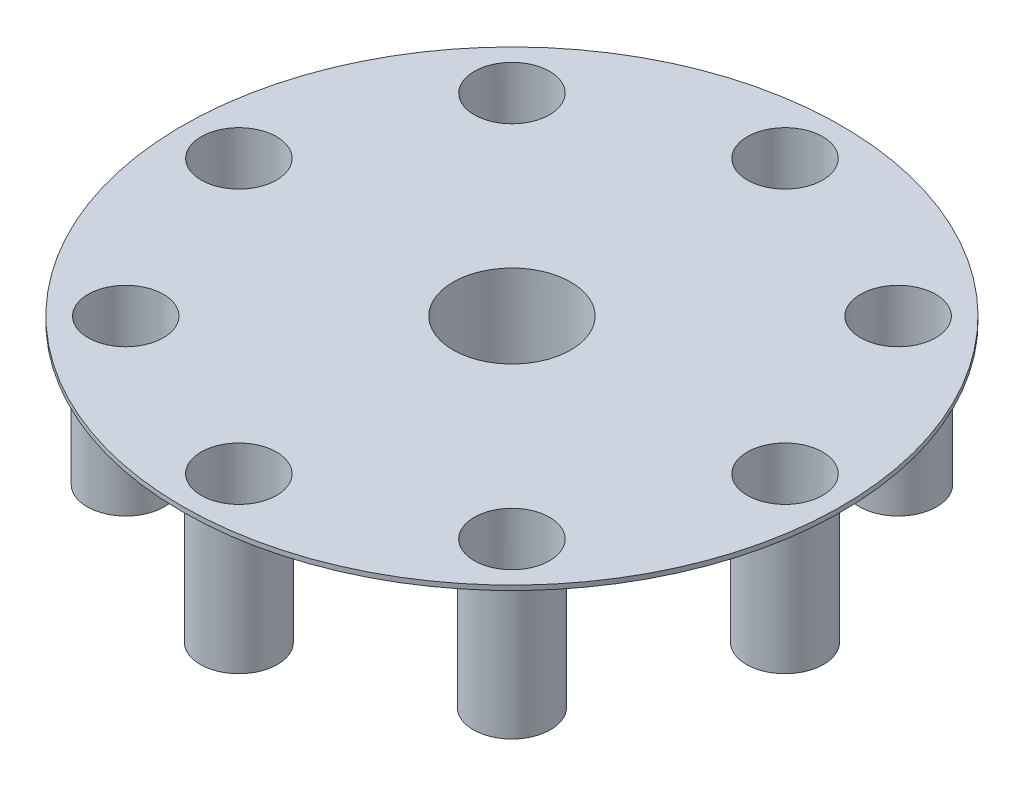
ISO-10303-21;
HEADER;
FILE_DESCRIPTION(('STEP AP214'),'2;1');
FILE_NAME('part.step','',(''),(''),'','','');
FILE_SCHEMA(('AUTOMOTIVE_DESIGN { 1 0 10303 214 1 1 1 1 }'));
ENDSEC;
DATA;
#1=APPLICATION_CONTEXT('core data for automotive mechanical design processes');
#2=APPLICATION_PROTOCOL_DEFINITION('international standard','automotive_design',2000,#1);
#3=PRODUCT_CONTEXT('',#1,'mechanical');
#4=PRODUCT('Part','Part','',(#3));
#5=PRODUCT_RELATED_PRODUCT_CATEGORY('part','',(#4));
#6=PRODUCT_DEFINITION_FORMATION('','',#4);
#7=PRODUCT_DEFINITION_CONTEXT('part definition',#1,'design');
#8=PRODUCT_DEFINITION('design','',#6,#7);
#9=PRODUCT_DEFINITION_SHAPE('','',#8);
#10=(LENGTH_UNIT() NAMED_UNIT(*) SI_UNIT(.MILLI.,.METRE.));
#11=(NAMED_UNIT(*) PLANE_ANGLE_UNIT() SI_UNIT($,.RADIAN.));
#12=(NAMED_UNIT(*) SI_UNIT($,.STERADIAN.) SOLID_ANGLE_UNIT());
#13=UNCERTAINTY_MEASURE_WITH_UNIT(LENGTH_MEASURE(1.E-05),#10,'distance_accuracy_value','');
#14=(GEOMETRIC_REPRESENTATION_CONTEXT(3) GLOBAL_UNCERTAINTY_ASSIGNED_CONTEXT((#13)) GLOBAL_UNIT_ASSIGNED_CONTEXT((#10,
#11,#12)) REPRESENTATION_CONTEXT('',''));
#15=CARTESIAN_POINT('',(0.,0.,0.));
#16=DIRECTION('',(0.,0.,1.));
#17=DIRECTION('',(1.,0.,0.));
#18=AXIS2_PLACEMENT_3D('',#15,#16,#17);
#19=CARTESIAN_POINT('',(0.,5.,0.));
#20=DIRECTION('',(0.,-1.,0.));
#21=DIRECTION('',(0.,0.,-1.));
#22=AXIS2_PLACEMENT_3D('',#19,#20,#21);
#23=CYLINDRICAL_SURFACE('',#22,350.);
#24=CARTESIAN_POINT('',(0.,5.,0.));
#25=DIRECTION('',(0.,1.,0.));
#26=DIRECTION('',(0.,0.,1.));
#27=AXIS2_PLACEMENT_3D('',#24,#25,#26);
#28=CIRCLE('',#27,350.);
#29=CARTESIAN_POINT('',(0.,5.,350.));
#30=VERTEX_POINT('',#29);
#31=EDGE_CURVE('E10',#30,#30,#28,.T.);
#32=ORIENTED_EDGE('',*,*,#31,.F.);
#33=EDGE_LOOP('',(#32));
#34=FACE_BOUND('',#33,.T.);
#35=CARTESIAN_POINT('',(0.,0.,0.));
#36=DIRECTION('',(0.,1.,0.));
#37=DIRECTION('',(0.,0.,1.));
#38=AXIS2_PLACEMENT_3D('',#35,#36,#37);
#39=CIRCLE('',#38,350.);
#40=CARTESIAN_POINT('',(0.,0.,350.));
#41=VERTEX_POINT('',#40);
#42=EDGE_CURVE('E42',#41,#41,#39,.T.);
#43=ORIENTED_EDGE('',*,*,#42,.T.);
#44=EDGE_LOOP('',(#43));
#45=FACE_BOUND('',#44,.T.);
#46=ADVANCED_FACE('F39',(#34,#45),#23,.T.);
#47=CARTESIAN_POINT('',(0.,5.,0.));
#48=DIRECTION('',(0.,1.,0.));
#49=DIRECTION('',(0.,0.,1.));
#50=AXIS2_PLACEMENT_3D('',#47,#48,#49);
#51=PLANE('',#50);
#52=CARTESIAN_POINT('',(-290.,5.,1.00518170746962E-12));
#53=DIRECTION('',(0.,1.,0.));
#54=DIRECTION('',(1.,0.,0.));
#55=AXIS2_PLACEMENT_3D('',#52,#53,#54);
#56=CIRCLE('',#55,40.);
#57=CARTESIAN_POINT('',(-250.,5.,8.65522453915899E-13));
#58=VERTEX_POINT('',#57);
#59=EDGE_CURVE('E76',#58,#58,#56,.T.);
#60=ORIENTED_EDGE('',*,*,#59,.F.);
#61=EDGE_LOOP('',(#60));
#62=FACE_BOUND('',#61,.T.);
#63=CARTESIAN_POINT('',(-205.060966544098,5.,205.0609665441));
#64=DIRECTION('',(0.,1.,0.));
#65=DIRECTION('',(0.707106781186544,0.,-0.707106781186551));
#66=AXIS2_PLACEMENT_3D('',#63,#64,#65);
#67=CIRCLE('',#66,40.);
#68=CARTESIAN_POINT('',(-176.776695296636,5.,176.776695296638));
#69=VERTEX_POINT('',#68);
#70=EDGE_CURVE('E86',#69,#69,#67,.T.);
#71=ORIENTED_EDGE('',*,*,#70,.F.);
#72=EDGE_LOOP('',(#71));
#73=FACE_BOUND('',#72,.T.);
#74=CARTESIAN_POINT('',(0.,5.,290.));
#75=DIRECTION('',(0.,1.,0.));
#76=DIRECTION('',(0.,0.,-1.));
#77=AXIS2_PLACEMENT_3D('',#74,#75,#76);
#78=CIRCLE('',#77,40.);
#79=CARTESIAN_POINT('',(0.,5.,250.));
#80=VERTEX_POINT('',#79);
#81=EDGE_CURVE('E81',#80,#80,#78,.T.);
#82=ORIENTED_EDGE('',*,*,#81,.F.);
#83=EDGE_LOOP('',(#82));
#84=FACE_BOUND('',#83,.T.);
#85=CARTESIAN_POINT('',(205.060966544101,5.,205.060966544097));
#86=DIRECTION('',(0.,1.,0.));
#87=DIRECTION('',(-0.707106781186554,0.,-0.707106781186541));
#88=AXIS2_PLACEMENT_3D('',#85,#86,#87);
#89=CIRCLE('',#88,40.);
#90=CARTESIAN_POINT('',(176.776695296638,5.,176.776695296635));
#91=VERTEX_POINT('',#90);
#92=EDGE_CURVE('E77',#91,#91,#89,.T.);
#93=ORIENTED_EDGE('',*,*,#92,.F.);
#94=EDGE_LOOP('',(#93));
#95=FACE_BOUND('',#94,.T.);
#96=CARTESIAN_POINT('',(290.,5.,-3.03024088399864E-12));
#97=DIRECTION('',(0.,1.,0.));
#98=DIRECTION('',(-1.,0.,0.));
#99=AXIS2_PLACEMENT_3D('',#96,#97,#98);
#100=CIRCLE('',#99,40.);
#101=CARTESIAN_POINT('',(250.,5.,-2.61126312333747E-12));
#102=VERTEX_POINT('',#101);
#103=EDGE_CURVE('E82',#102,#102,#100,.T.);
#104=ORIENTED_EDGE('',*,*,#103,.F.);
#105=EDGE_LOOP('',(#104));
#106=FACE_BOUND('',#105,.T.);
#107=CARTESIAN_POINT('',(205.060966544096,5.,-205.060966544101));
#108=DIRECTION('',(0.,1.,0.));
#109=DIRECTION('',(-0.707106781186539,0.,0.707106781186556));
#110=AXIS2_PLACEMENT_3D('',#107,#108,#109);
#111=CIRCLE('',#110,40.);
#112=CARTESIAN_POINT('',(176.776695296635,5.,-176.776695296639));
#113=VERTEX_POINT('',#112);
#114=EDGE_CURVE('E93',#113,#113,#111,.T.);
#115=ORIENTED_EDGE('',*,*,#114,.F.);
#116=EDGE_LOOP('',(#115));
#117=FACE_BOUND('',#116,.T.);
#118=CARTESIAN_POINT('',(-205.060966544099,5.,-205.060966544098));
#119=DIRECTION('',(0.,1.,0.));
#120=DIRECTION('',(0.707106781186549,0.,0.707106781186546));
#121=AXIS2_PLACEMENT_3D('',#118,#119,#120);
#122=CIRCLE('',#121,40.);
#123=CARTESIAN_POINT('',(-176.776695296637,5.,-176.776695296637));
#124=VERTEX_POINT('',#123);
#125=EDGE_CURVE('E66',#124,#124,#122,.T.);
#126=ORIENTED_EDGE('',*,*,#125,.F.);
#127=EDGE_LOOP('',(#126));
#128=FACE_BOUND('',#127,.T.);
#129=CARTESIAN_POINT('',(0.,5.,-290.));
#130=DIRECTION('',(0.,1.,0.));
#131=DIRECTION('',(0.,0.,1.));
#132=AXIS2_PLACEMENT_3D('',#129,#130,#131);
#133=CIRCLE('',#132,40.);
#134=CARTESIAN_POINT('',(0.,5.,-250.));
#135=VERTEX_POINT('',#134);
#136=EDGE_CURVE('E56',#135,#135,#133,.T.);
#137=ORIENTED_EDGE('',*,*,#136,.F.);
#138=EDGE_LOOP('',(#137));
#139=FACE_BOUND('',#138,.T.);
#140=CARTESIAN_POINT('',(0.,5.,0.));
#141=DIRECTION('',(0.,1.,0.));
#142=DIRECTION('',(0.,0.,1.));
#143=AXIS2_PLACEMENT_3D('',#140,#141,#142);
#144=CIRCLE('',#143,62.5);
#145=CARTESIAN_POINT('',(0.,5.,62.5));
#146=VERTEX_POINT('',#145);
#147=EDGE_CURVE('E51',#146,#146,#144,.T.);
#148=ORIENTED_EDGE('',*,*,#147,.F.);
#149=EDGE_LOOP('',(#148));
#150=FACE_BOUND('',#149,.T.);
#151=ORIENTED_EDGE('',*,*,#31,.T.);
#152=EDGE_LOOP('',(#151));
#153=FACE_BOUND('',#152,.T.);
#154=ADVANCED_FACE('F204',(#62,#73,#84,#95,#106,#117,#128,#139,#150,#153),#51,.T.);
#155=CARTESIAN_POINT('',(0.,0.,0.));
#156=DIRECTION('',(0.,1.,0.));
#157=DIRECTION('',(0.,0.,1.));
#158=AXIS2_PLACEMENT_3D('',#155,#156,#157);
#159=PLANE('',#158);
#160=CARTESIAN_POINT('',(205.060966544096,0.,-205.060966544101));
#161=DIRECTION('',(0.,-1.,0.));
#162=DIRECTION('',(0.707106781186539,0.,-0.707106781186556));
#163=AXIS2_PLACEMENT_3D('',#160,#161,#162);
#164=CIRCLE('',#163,41.);
#165=CARTESIAN_POINT('',(234.052344572744,0.,-234.05234457275));
#166=VERTEX_POINT('',#165);
#167=EDGE_CURVE('E189',#166,#166,#164,.T.);
#168=ORIENTED_EDGE('',*,*,#167,.F.);
#169=EDGE_LOOP('',(#168));
#170=FACE_BOUND('',#169,.T.);
#171=CARTESIAN_POINT('',(290.,0.,-3.03024088399864E-12));
#172=DIRECTION('',(0.,-1.,0.));
#173=DIRECTION('',(1.,0.,0.));
#174=AXIS2_PLACEMENT_3D('',#171,#172,#173);
#175=CIRCLE('',#174,41.);
#176=CARTESIAN_POINT('',(331.,0.,-3.45969308867635E-12));
#177=VERTEX_POINT('',#176);
#178=EDGE_CURVE('E177',#177,#177,#175,.T.);
#179=ORIENTED_EDGE('',*,*,#178,.F.);
#180=EDGE_LOOP('',(#179));
#181=FACE_BOUND('',#180,.T.);
#182=CARTESIAN_POINT('',(205.060966544101,0.,205.060966544097));
#183=DIRECTION('',(0.,-1.,0.));
#184=DIRECTION('',(0.707106781186554,0.,0.707106781186541));
#185=AXIS2_PLACEMENT_3D('',#182,#183,#184);
#186=CIRCLE('',#185,41.);
#187=CARTESIAN_POINT('',(234.052344572749,0.,234.052344572745));
#188=VERTEX_POINT('',#187);
#189=EDGE_CURVE('E165',#188,#188,#186,.T.);
#190=ORIENTED_EDGE('',*,*,#189,.F.);
#191=EDGE_LOOP('',(#190));
#192=FACE_BOUND('',#191,.T.);
#193=CARTESIAN_POINT('',(0.,0.,290.));
#194=DIRECTION('',(0.,-1.,0.));
#195=DIRECTION('',(0.,0.,1.));
#196=AXIS2_PLACEMENT_3D('',#193,#194,#195);
#197=CIRCLE('',#196,41.);
#198=CARTESIAN_POINT('',(0.,0.,331.));
#199=VERTEX_POINT('',#198);
#200=EDGE_CURVE('E153',#199,#199,#197,.T.);
#201=ORIENTED_EDGE('',*,*,#200,.F.);
#202=EDGE_LOOP('',(#201));
#203=FACE_BOUND('',#202,.T.);
#204=CARTESIAN_POINT('',(-205.060966544098,0.,205.0609665441));
#205=DIRECTION('',(0.,-1.,0.));
#206=DIRECTION('',(-0.707106781186544,0.,0.707106781186551));
#207=AXIS2_PLACEMENT_3D('',#204,#205,#206);
#208=CIRCLE('',#207,41.);
#209=CARTESIAN_POINT('',(-234.052344572746,0.,234.052344572748));
#210=VERTEX_POINT('',#209);
#211=EDGE_CURVE('E141',#210,#210,#208,.T.);
#212=ORIENTED_EDGE('',*,*,#211,.F.);
#213=EDGE_LOOP('',(#212));
#214=FACE_BOUND('',#213,.T.);
#215=CARTESIAN_POINT('',(-290.,0.,1.00518170746962E-12));
#216=DIRECTION('',(0.,-1.,0.));
#217=DIRECTION('',(-1.,0.,0.));
#218=AXIS2_PLACEMENT_3D('',#215,#216,#217);
#219=CIRCLE('',#218,41.);
#220=CARTESIAN_POINT('',(-331.,0.,1.14833244236219E-12));
#221=VERTEX_POINT('',#220);
#222=EDGE_CURVE('E129',#221,#221,#219,.T.);
#223=ORIENTED_EDGE('',*,*,#222,.F.);
#224=EDGE_LOOP('',(#223));
#225=FACE_BOUND('',#224,.T.);
#226=CARTESIAN_POINT('',(-205.060966544099,0.,-205.060966544098));
#227=DIRECTION('',(0.,-1.,0.));
#228=DIRECTION('',(-0.707106781186549,0.,-0.707106781186546));
#229=AXIS2_PLACEMENT_3D('',#226,#227,#228);
#230=CIRCLE('',#229,41.);
#231=CARTESIAN_POINT('',(-234.052344572748,0.,-234.052344572747));
#232=VERTEX_POINT('',#231);
#233=EDGE_CURVE('E117',#232,#232,#230,.T.);
#234=ORIENTED_EDGE('',*,*,#233,.F.);
#235=EDGE_LOOP('',(#234));
#236=FACE_BOUND('',#235,.T.);
#237=CARTESIAN_POINT('',(0.,0.,0.));
#238=DIRECTION('',(0.,-1.,0.));
#239=DIRECTION('',(0.,0.,-1.));
#240=AXIS2_PLACEMENT_3D('',#237,#238,#239);
#241=CIRCLE('',#240,63.5);
#242=CARTESIAN_POINT('',(0.,0.,-63.5));
#243=VERTEX_POINT('',#242);
#244=EDGE_CURVE('E105',#243,#243,#241,.T.);
#245=ORIENTED_EDGE('',*,*,#244,.F.);
#246=EDGE_LOOP('',(#245));
#247=FACE_BOUND('',#246,.T.);
#248=CARTESIAN_POINT('',(0.,0.,-290.));
#249=DIRECTION('',(0.,-1.,0.));
#250=DIRECTION('',(0.,0.,-1.));
#251=AXIS2_PLACEMENT_3D('',#248,#249,#250);
#252=CIRCLE('',#251,41.);
#253=CARTESIAN_POINT('',(0.,0.,-331.));
#254=VERTEX_POINT('',#253);
#255=EDGE_CURVE('E65',#254,#254,#252,.T.);
#256=ORIENTED_EDGE('',*,*,#255,.F.);
#257=EDGE_LOOP('',(#256));
#258=FACE_BOUND('',#257,.T.);
#259=ORIENTED_EDGE('',*,*,#42,.F.);
#260=EDGE_LOOP('',(#259));
#261=FACE_BOUND('',#260,.T.);
#262=ADVANCED_FACE('F200',(#170,#181,#192,#203,#214,#225,#236,#247,#258,#261),#159,.F.);
#263=CARTESIAN_POINT('',(0.,0.,0.));
#264=DIRECTION('',(0.,1.,0.));
#265=DIRECTION('',(0.,0.,1.));
#266=AXIS2_PLACEMENT_3D('',#263,#264,#265);
#267=CYLINDRICAL_SURFACE('',#266,62.5);
#268=ORIENTED_EDGE('',*,*,#147,.T.);
#269=EDGE_LOOP('',(#268));
#270=FACE_BOUND('',#269,.T.);
#271=CARTESIAN_POINT('',(0.,-100.,0.));
#272=DIRECTION('',(0.,-1.,0.));
#273=DIRECTION('',(0.,0.,-1.));
#274=AXIS2_PLACEMENT_3D('',#271,#272,#273);
#275=CIRCLE('',#274,62.5);
#276=CARTESIAN_POINT('',(0.,-100.,-62.5));
#277=VERTEX_POINT('',#276);
#278=EDGE_CURVE('E101',#277,#277,#275,.T.);
#279=ORIENTED_EDGE('',*,*,#278,.T.);
#280=EDGE_LOOP('',(#279));
#281=FACE_BOUND('',#280,.T.);
#282=ADVANCED_FACE('F203',(#270,#281),#267,.F.);
#283=CARTESIAN_POINT('',(0.,0.,-290.));
#284=DIRECTION('',(0.,1.,0.));
#285=DIRECTION('',(0.,0.,1.));
#286=AXIS2_PLACEMENT_3D('',#283,#284,#285);
#287=CYLINDRICAL_SURFACE('',#286,40.);
#288=ORIENTED_EDGE('',*,*,#136,.T.);
#289=EDGE_LOOP('',(#288));
#290=FACE_BOUND('',#289,.T.);
#291=CARTESIAN_POINT('',(0.,-150.,-290.));
#292=DIRECTION('',(0.,-1.,0.));
#293=DIRECTION('',(0.,0.,-1.));
#294=AXIS2_PLACEMENT_3D('',#291,#292,#293);
#295=CIRCLE('',#294,40.);
#296=CARTESIAN_POINT('',(0.,-150.,-330.));
#297=VERTEX_POINT('',#296);
#298=EDGE_CURVE('E61',#297,#297,#295,.T.);
#299=ORIENTED_EDGE('',*,*,#298,.T.);
#300=EDGE_LOOP('',(#299));
#301=FACE_BOUND('',#300,.T.);
#302=ADVANCED_FACE('F237',(#290,#301),#287,.F.);
#303=CARTESIAN_POINT('',(0.,-150.,-290.));
#304=DIRECTION('',(0.,1.,0.));
#305=DIRECTION('',(0.,0.,1.));
#306=AXIS2_PLACEMENT_3D('',#303,#304,#305);
#307=PLANE('',#306);
#308=CARTESIAN_POINT('',(0.,-150.,-290.));
#309=DIRECTION('',(0.,-1.,0.));
#310=DIRECTION('',(0.,0.,-1.));
#311=AXIS2_PLACEMENT_3D('',#308,#309,#310);
#312=CIRCLE('',#311,41.);
#313=CARTESIAN_POINT('',(0.,-150.,-331.));
#314=VERTEX_POINT('',#313);
#315=EDGE_CURVE('E60',#314,#314,#312,.T.);
#316=ORIENTED_EDGE('',*,*,#315,.T.);
#317=EDGE_LOOP('',(#316));
#318=FACE_BOUND('',#317,.T.);
#319=ORIENTED_EDGE('',*,*,#298,.F.);
#320=EDGE_LOOP('',(#319));
#321=FACE_BOUND('',#320,.T.);
#322=ADVANCED_FACE('F241',(#318,#321),#307,.F.);
#323=CARTESIAN_POINT('',(0.,0.,-290.));
#324=DIRECTION('',(0.,-1.,0.));
#325=DIRECTION('',(0.,0.,-1.));
#326=AXIS2_PLACEMENT_3D('',#323,#324,#325);
#327=CYLINDRICAL_SURFACE('',#326,41.);
#328=ORIENTED_EDGE('',*,*,#255,.T.);
#329=EDGE_LOOP('',(#328));
#330=FACE_BOUND('',#329,.T.);
#331=ORIENTED_EDGE('',*,*,#315,.F.);
#332=EDGE_LOOP('',(#331));
#333=FACE_BOUND('',#332,.T.);
#334=ADVANCED_FACE('F245',(#330,#333),#327,.T.);
#335=CARTESIAN_POINT('',(-205.060966544099,0.,-205.060966544098));
#336=DIRECTION('',(0.,1.,0.));
#337=DIRECTION('',(0.,0.,1.));
#338=AXIS2_PLACEMENT_3D('',#335,#336,#337);
#339=CYLINDRICAL_SURFACE('',#338,40.);
#340=ORIENTED_EDGE('',*,*,#125,.T.);
#341=EDGE_LOOP('',(#340));
#342=FACE_BOUND('',#341,.T.);
#343=CARTESIAN_POINT('',(-205.060966544099,-150.,-205.060966544098));
#344=DIRECTION('',(0.,-1.,0.));
#345=DIRECTION('',(-0.707106781186549,0.,-0.707106781186546));
#346=AXIS2_PLACEMENT_3D('',#343,#344,#345);
#347=CIRCLE('',#346,40.);
#348=CARTESIAN_POINT('',(-233.345237791561,-150.,-233.34523779156));
#349=VERTEX_POINT('',#348);
#350=EDGE_CURVE('E113',#349,#349,#347,.T.);
#351=ORIENTED_EDGE('',*,*,#350,.T.);
#352=EDGE_LOOP('',(#351));
#353=FACE_BOUND('',#352,.T.);
#354=ADVANCED_FACE('F249',(#342,#353),#339,.F.);
#355=CARTESIAN_POINT('',(205.060966544096,0.,-205.060966544101));
#356=DIRECTION('',(0.,1.,0.));
#357=DIRECTION('',(0.,0.,1.));
#358=AXIS2_PLACEMENT_3D('',#355,#356,#357);
#359=CYLINDRICAL_SURFACE('',#358,40.);
#360=ORIENTED_EDGE('',*,*,#114,.T.);
#361=EDGE_LOOP('',(#360));
#362=FACE_BOUND('',#361,.T.);
#363=CARTESIAN_POINT('',(205.060966544096,-150.,-205.060966544101));
#364=DIRECTION('',(0.,-1.,0.));
#365=DIRECTION('',(0.707106781186539,0.,-0.707106781186556));
#366=AXIS2_PLACEMENT_3D('',#363,#364,#365);
#367=CIRCLE('',#366,40.);
#368=CARTESIAN_POINT('',(233.345237791558,-150.,-233.345237791564));
#369=VERTEX_POINT('',#368);
#370=EDGE_CURVE('E185',#369,#369,#367,.T.);
#371=ORIENTED_EDGE('',*,*,#370,.T.);
#372=EDGE_LOOP('',(#371));
#373=FACE_BOUND('',#372,.T.);
#374=ADVANCED_FACE('F253',(#362,#373),#359,.F.);
#375=CARTESIAN_POINT('',(290.,0.,-3.03024088399864E-12));
#376=DIRECTION('',(0.,1.,0.));
#377=DIRECTION('',(0.,0.,1.));
#378=AXIS2_PLACEMENT_3D('',#375,#376,#377);
#379=CYLINDRICAL_SURFACE('',#378,40.);
#380=ORIENTED_EDGE('',*,*,#103,.T.);
#381=EDGE_LOOP('',(#380));
#382=FACE_BOUND('',#381,.T.);
#383=CARTESIAN_POINT('',(290.,-150.,-3.03024088399864E-12));
#384=DIRECTION('',(0.,-1.,0.));
#385=DIRECTION('',(1.,0.,0.));
#386=AXIS2_PLACEMENT_3D('',#383,#384,#385);
#387=CIRCLE('',#386,40.);
#388=CARTESIAN_POINT('',(330.,-150.,-3.44921864465982E-12));
#389=VERTEX_POINT('',#388);
#390=EDGE_CURVE('E173',#389,#389,#387,.T.);
#391=ORIENTED_EDGE('',*,*,#390,.T.);
#392=EDGE_LOOP('',(#391));
#393=FACE_BOUND('',#392,.T.);
#394=ADVANCED_FACE('F259',(#382,#393),#379,.F.);
#395=CARTESIAN_POINT('',(205.060966544101,0.,205.060966544097));
#396=DIRECTION('',(0.,1.,0.));
#397=DIRECTION('',(0.,0.,1.));
#398=AXIS2_PLACEMENT_3D('',#395,#396,#397);
#399=CYLINDRICAL_SURFACE('',#398,40.);
#400=ORIENTED_EDGE('',*,*,#92,.T.);
#401=EDGE_LOOP('',(#400));
#402=FACE_BOUND('',#401,.T.);
#403=CARTESIAN_POINT('',(205.060966544101,-150.,205.060966544097));
#404=DIRECTION('',(0.,-1.,0.));
#405=DIRECTION('',(0.707106781186554,0.,0.707106781186541));
#406=AXIS2_PLACEMENT_3D('',#403,#404,#405);
#407=CIRCLE('',#406,40.);
#408=CARTESIAN_POINT('',(233.345237791563,-150.,233.345237791559));
#409=VERTEX_POINT('',#408);
#410=EDGE_CURVE('E161',#409,#409,#407,.T.);
#411=ORIENTED_EDGE('',*,*,#410,.T.);
#412=EDGE_LOOP('',(#411));
#413=FACE_BOUND('',#412,.T.);
#414=ADVANCED_FACE('F255',(#402,#413),#399,.F.);
#415=CARTESIAN_POINT('',(0.,0.,290.));
#416=DIRECTION('',(0.,1.,0.));
#417=DIRECTION('',(0.,0.,1.));
#418=AXIS2_PLACEMENT_3D('',#415,#416,#417);
#419=CYLINDRICAL_SURFACE('',#418,40.);
#420=ORIENTED_EDGE('',*,*,#81,.T.);
#421=EDGE_LOOP('',(#420));
#422=FACE_BOUND('',#421,.T.);
#423=CARTESIAN_POINT('',(0.,-150.,290.));
#424=DIRECTION('',(0.,-1.,0.));
#425=DIRECTION('',(0.,0.,1.));
#426=AXIS2_PLACEMENT_3D('',#423,#424,#425);
#427=CIRCLE('',#426,40.);
#428=CARTESIAN_POINT('',(0.,-150.,330.));
#429=VERTEX_POINT('',#428);
#430=EDGE_CURVE('E149',#429,#429,#427,.T.);
#431=ORIENTED_EDGE('',*,*,#430,.T.);
#432=EDGE_LOOP('',(#431));
#433=FACE_BOUND('',#432,.T.);
#434=ADVANCED_FACE('F258',(#422,#433),#419,.F.);
#435=CARTESIAN_POINT('',(-205.060966544098,0.,205.0609665441));
#436=DIRECTION('',(0.,1.,0.));
#437=DIRECTION('',(0.,0.,1.));
#438=AXIS2_PLACEMENT_3D('',#435,#436,#437);
#439=CYLINDRICAL_SURFACE('',#438,40.);
#440=ORIENTED_EDGE('',*,*,#70,.T.);
#441=EDGE_LOOP('',(#440));
#442=FACE_BOUND('',#441,.T.);
#443=CARTESIAN_POINT('',(-205.060966544098,-150.,205.0609665441));
#444=DIRECTION('',(0.,-1.,0.));
#445=DIRECTION('',(-0.707106781186544,0.,0.707106781186551));
#446=AXIS2_PLACEMENT_3D('',#443,#444,#445);
#447=CIRCLE('',#446,40.);
#448=CARTESIAN_POINT('',(-233.345237791559,-150.,233.345237791562));
#449=VERTEX_POINT('',#448);
#450=EDGE_CURVE('E137',#449,#449,#447,.T.);
#451=ORIENTED_EDGE('',*,*,#450,.T.);
#452=EDGE_LOOP('',(#451));
#453=FACE_BOUND('',#452,.T.);
#454=ADVANCED_FACE('F263',(#442,#453),#439,.F.);
#455=CARTESIAN_POINT('',(-290.,0.,1.00518170746962E-12));
#456=DIRECTION('',(0.,1.,0.));
#457=DIRECTION('',(0.,0.,1.));
#458=AXIS2_PLACEMENT_3D('',#455,#456,#457);
#459=CYLINDRICAL_SURFACE('',#458,40.);
#460=ORIENTED_EDGE('',*,*,#59,.T.);
#461=EDGE_LOOP('',(#460));
#462=FACE_BOUND('',#461,.T.);
#463=CARTESIAN_POINT('',(-290.,-150.,1.00518170746962E-12));
#464=DIRECTION('',(0.,-1.,0.));
#465=DIRECTION('',(-1.,0.,0.));
#466=AXIS2_PLACEMENT_3D('',#463,#464,#465);
#467=CIRCLE('',#466,40.);
#468=CARTESIAN_POINT('',(-330.,-150.,1.14484096102335E-12));
#469=VERTEX_POINT('',#468);
#470=EDGE_CURVE('E125',#469,#469,#467,.T.);
#471=ORIENTED_EDGE('',*,*,#470,.T.);
#472=EDGE_LOOP('',(#471));
#473=FACE_BOUND('',#472,.T.);
#474=ADVANCED_FACE('F267',(#462,#473),#459,.F.);
#475=CARTESIAN_POINT('',(0.,-100.,0.));
#476=DIRECTION('',(0.,1.,0.));
#477=DIRECTION('',(0.,0.,1.));
#478=AXIS2_PLACEMENT_3D('',#475,#476,#477);
#479=PLANE('',#478);
#480=CARTESIAN_POINT('',(0.,-100.,0.));
#481=DIRECTION('',(0.,-1.,0.));
#482=DIRECTION('',(0.,0.,-1.));
#483=AXIS2_PLACEMENT_3D('',#480,#481,#482);
#484=CIRCLE('',#483,63.5);
#485=CARTESIAN_POINT('',(0.,-100.,-63.5));
#486=VERTEX_POINT('',#485);
#487=EDGE_CURVE('E97',#486,#486,#484,.T.);
#488=ORIENTED_EDGE('',*,*,#487,.T.);
#489=EDGE_LOOP('',(#488));
#490=FACE_BOUND('',#489,.T.);
#491=ORIENTED_EDGE('',*,*,#278,.F.);
#492=EDGE_LOOP('',(#491));
#493=FACE_BOUND('',#492,.T.);
#494=ADVANCED_FACE('F271',(#490,#493),#479,.F.);
#495=CARTESIAN_POINT('',(0.,0.,0.));
#496=DIRECTION('',(0.,-1.,0.));
#497=DIRECTION('',(0.,0.,-1.));
#498=AXIS2_PLACEMENT_3D('',#495,#496,#497);
#499=CYLINDRICAL_SURFACE('',#498,63.5);
#500=ORIENTED_EDGE('',*,*,#244,.T.);
#501=EDGE_LOOP('',(#500));
#502=FACE_BOUND('',#501,.T.);
#503=ORIENTED_EDGE('',*,*,#487,.F.);
#504=EDGE_LOOP('',(#503));
#505=FACE_BOUND('',#504,.T.);
#506=ADVANCED_FACE('F281',(#502,#505),#499,.T.);
#507=CARTESIAN_POINT('',(-205.060966544099,-150.,-205.060966544098));
#508=DIRECTION('',(0.,1.,0.));
#509=DIRECTION('',(0.707106781186549,0.,0.707106781186546));
#510=AXIS2_PLACEMENT_3D('',#507,#508,#509);
#511=PLANE('',#510);
#512=CARTESIAN_POINT('',(-205.060966544099,-150.,-205.060966544098));
#513=DIRECTION('',(0.,-1.,0.));
#514=DIRECTION('',(-0.707106781186549,0.,-0.707106781186546));
#515=AXIS2_PLACEMENT_3D('',#512,#513,#514);
#516=CIRCLE('',#515,41.);
#517=CARTESIAN_POINT('',(-234.052344572748,-150.,-234.052344572747));
#518=VERTEX_POINT('',#517);
#519=EDGE_CURVE('E106',#518,#518,#516,.T.);
#520=ORIENTED_EDGE('',*,*,#519,.T.);
#521=EDGE_LOOP('',(#520));
#522=FACE_BOUND('',#521,.T.);
#523=ORIENTED_EDGE('',*,*,#350,.F.);
#524=EDGE_LOOP('',(#523));
#525=FACE_BOUND('',#524,.T.);
#526=ADVANCED_FACE('F285',(#522,#525),#511,.F.);
#527=CARTESIAN_POINT('',(-205.060966544099,0.,-205.060966544098));
#528=DIRECTION('',(0.,-1.,0.));
#529=DIRECTION('',(-0.707106781186549,0.,-0.707106781186546));
#530=AXIS2_PLACEMENT_3D('',#527,#528,#529);
#531=CYLINDRICAL_SURFACE('',#530,41.);
#532=ORIENTED_EDGE('',*,*,#233,.T.);
#533=EDGE_LOOP('',(#532));
#534=FACE_BOUND('',#533,.T.);
#535=ORIENTED_EDGE('',*,*,#519,.F.);
#536=EDGE_LOOP('',(#535));
#537=FACE_BOUND('',#536,.T.);
#538=ADVANCED_FACE('F289',(#534,#537),#531,.T.);
#539=CARTESIAN_POINT('',(-290.,-150.,1.00518170746962E-12));
#540=DIRECTION('',(0.,1.,0.));
#541=DIRECTION('',(1.,0.,0.));
#542=AXIS2_PLACEMENT_3D('',#539,#540,#541);
#543=PLANE('',#542);
#544=CARTESIAN_POINT('',(-290.,-150.,1.00518170746962E-12));
#545=DIRECTION('',(0.,-1.,0.));
#546=DIRECTION('',(-1.,0.,0.));
#547=AXIS2_PLACEMENT_3D('',#544,#545,#546);
#548=CIRCLE('',#547,41.);
#549=CARTESIAN_POINT('',(-331.,-150.,1.14833244236219E-12));
#550=VERTEX_POINT('',#549);
#551=EDGE_CURVE('E118',#550,#550,#548,.T.);
#552=ORIENTED_EDGE('',*,*,#551,.T.);
#553=EDGE_LOOP('',(#552));
#554=FACE_BOUND('',#553,.T.);
#555=ORIENTED_EDGE('',*,*,#470,.F.);
#556=EDGE_LOOP('',(#555));
#557=FACE_BOUND('',#556,.T.);
#558=ADVANCED_FACE('F293',(#554,#557),#543,.F.);
#559=CARTESIAN_POINT('',(-290.,0.,1.00518170746962E-12));
#560=DIRECTION('',(0.,-1.,0.));
#561=DIRECTION('',(-1.,0.,0.));
#562=AXIS2_PLACEMENT_3D('',#559,#560,#561);
#563=CYLINDRICAL_SURFACE('',#562,41.);
#564=ORIENTED_EDGE('',*,*,#222,.T.);
#565=EDGE_LOOP('',(#564));
#566=FACE_BOUND('',#565,.T.);
#567=ORIENTED_EDGE('',*,*,#551,.F.);
#568=EDGE_LOOP('',(#567));
#569=FACE_BOUND('',#568,.T.);
#570=ADVANCED_FACE('F297',(#566,#569),#563,.T.);
#571=CARTESIAN_POINT('',(-205.060966544098,-150.,205.0609665441));
#572=DIRECTION('',(0.,1.,0.));
#573=DIRECTION('',(0.707106781186544,0.,-0.707106781186551));
#574=AXIS2_PLACEMENT_3D('',#571,#572,#573);
#575=PLANE('',#574);
#576=CARTESIAN_POINT('',(-205.060966544098,-150.,205.0609665441));
#577=DIRECTION('',(0.,-1.,0.));
#578=DIRECTION('',(-0.707106781186544,0.,0.707106781186551));
#579=AXIS2_PLACEMENT_3D('',#576,#577,#578);
#580=CIRCLE('',#579,41.);
#581=CARTESIAN_POINT('',(-234.052344572746,-150.,234.052344572748));
#582=VERTEX_POINT('',#581);
#583=EDGE_CURVE('E130',#582,#582,#580,.T.);
#584=ORIENTED_EDGE('',*,*,#583,.T.);
#585=EDGE_LOOP('',(#584));
#586=FACE_BOUND('',#585,.T.);
#587=ORIENTED_EDGE('',*,*,#450,.F.);
#588=EDGE_LOOP('',(#587));
#589=FACE_BOUND('',#588,.T.);
#590=ADVANCED_FACE('F301',(#586,#589),#575,.F.);
#591=CARTESIAN_POINT('',(-205.060966544098,0.,205.0609665441));
#592=DIRECTION('',(0.,-1.,0.));
#593=DIRECTION('',(-0.707106781186544,0.,0.707106781186551));
#594=AXIS2_PLACEMENT_3D('',#591,#592,#593);
#595=CYLINDRICAL_SURFACE('',#594,41.);
#596=ORIENTED_EDGE('',*,*,#211,.T.);
#597=EDGE_LOOP('',(#596));
#598=FACE_BOUND('',#597,.T.);
#599=ORIENTED_EDGE('',*,*,#583,.F.);
#600=EDGE_LOOP('',(#599));
#601=FACE_BOUND('',#600,.T.);
#602=ADVANCED_FACE('F305',(#598,#601),#595,.T.);
#603=CARTESIAN_POINT('',(0.,-150.,290.));
#604=DIRECTION('',(0.,1.,0.));
#605=DIRECTION('',(0.,0.,-1.));
#606=AXIS2_PLACEMENT_3D('',#603,#604,#605);
#607=PLANE('',#606);
#608=CARTESIAN_POINT('',(0.,-150.,290.));
#609=DIRECTION('',(0.,-1.,0.));
#610=DIRECTION('',(0.,0.,1.));
#611=AXIS2_PLACEMENT_3D('',#608,#609,#610);
#612=CIRCLE('',#611,41.);
#613=CARTESIAN_POINT('',(0.,-150.,331.));
#614=VERTEX_POINT('',#613);
#615=EDGE_CURVE('E142',#614,#614,#612,.T.);
#616=ORIENTED_EDGE('',*,*,#615,.T.);
#617=EDGE_LOOP('',(#616));
#618=FACE_BOUND('',#617,.T.);
#619=ORIENTED_EDGE('',*,*,#430,.F.);
#620=EDGE_LOOP('',(#619));
#621=FACE_BOUND('',#620,.T.);
#622=ADVANCED_FACE('F309',(#618,#621),#607,.F.);
#623=CARTESIAN_POINT('',(0.,0.,290.));
#624=DIRECTION('',(0.,-1.,0.));
#625=DIRECTION('',(0.,0.,1.));
#626=AXIS2_PLACEMENT_3D('',#623,#624,#625);
#627=CYLINDRICAL_SURFACE('',#626,41.);
#628=ORIENTED_EDGE('',*,*,#200,.T.);
#629=EDGE_LOOP('',(#628));
#630=FACE_BOUND('',#629,.T.);
#631=ORIENTED_EDGE('',*,*,#615,.F.);
#632=EDGE_LOOP('',(#631));
#633=FACE_BOUND('',#632,.T.);
#634=ADVANCED_FACE('F313',(#630,#633),#627,.T.);
#635=CARTESIAN_POINT('',(205.060966544101,-150.,205.060966544097));
#636=DIRECTION('',(0.,1.,0.));
#637=DIRECTION('',(-0.707106781186554,0.,-0.707106781186541));
#638=AXIS2_PLACEMENT_3D('',#635,#636,#637);
#639=PLANE('',#638);
#640=CARTESIAN_POINT('',(205.060966544101,-150.,205.060966544097));
#641=DIRECTION('',(0.,-1.,0.));
#642=DIRECTION('',(0.707106781186554,0.,0.707106781186541));
#643=AXIS2_PLACEMENT_3D('',#640,#641,#642);
#644=CIRCLE('',#643,41.);
#645=CARTESIAN_POINT('',(234.052344572749,-150.,234.052344572745));
#646=VERTEX_POINT('',#645);
#647=EDGE_CURVE('E154',#646,#646,#644,.T.);
#648=ORIENTED_EDGE('',*,*,#647,.T.);
#649=EDGE_LOOP('',(#648));
#650=FACE_BOUND('',#649,.T.);
#651=ORIENTED_EDGE('',*,*,#410,.F.);
#652=EDGE_LOOP('',(#651));
#653=FACE_BOUND('',#652,.T.);
#654=ADVANCED_FACE('F317',(#650,#653),#639,.F.);
#655=CARTESIAN_POINT('',(205.060966544101,0.,205.060966544097));
#656=DIRECTION('',(0.,-1.,0.));
#657=DIRECTION('',(0.707106781186554,0.,0.707106781186541));
#658=AXIS2_PLACEMENT_3D('',#655,#656,#657);
#659=CYLINDRICAL_SURFACE('',#658,41.);
#660=ORIENTED_EDGE('',*,*,#189,.T.);
#661=EDGE_LOOP('',(#660));
#662=FACE_BOUND('',#661,.T.);
#663=ORIENTED_EDGE('',*,*,#647,.F.);
#664=EDGE_LOOP('',(#663));
#665=FACE_BOUND('',#664,.T.);
#666=ADVANCED_FACE('F321',(#662,#665),#659,.T.);
#667=CARTESIAN_POINT('',(290.,-150.,-3.03024088399864E-12));
#668=DIRECTION('',(0.,1.,0.));
#669=DIRECTION('',(-1.,0.,0.));
#670=AXIS2_PLACEMENT_3D('',#667,#668,#669);
#671=PLANE('',#670);
#672=CARTESIAN_POINT('',(290.,-150.,-3.03024088399864E-12));
#673=DIRECTION('',(0.,-1.,0.));
#674=DIRECTION('',(1.,0.,0.));
#675=AXIS2_PLACEMENT_3D('',#672,#673,#674);
#676=CIRCLE('',#675,41.);
#677=CARTESIAN_POINT('',(331.,-150.,-3.45969308867635E-12));
#678=VERTEX_POINT('',#677);
#679=EDGE_CURVE('E166',#678,#678,#676,.T.);
#680=ORIENTED_EDGE('',*,*,#679,.T.);
#681=EDGE_LOOP('',(#680));
#682=FACE_BOUND('',#681,.T.);
#683=ORIENTED_EDGE('',*,*,#390,.F.);
#684=EDGE_LOOP('',(#683));
#685=FACE_BOUND('',#684,.T.);
#686=ADVANCED_FACE('F325',(#682,#685),#671,.F.);
#687=CARTESIAN_POINT('',(290.,0.,-3.03024088399864E-12));
#688=DIRECTION('',(0.,-1.,0.));
#689=DIRECTION('',(1.,0.,0.));
#690=AXIS2_PLACEMENT_3D('',#687,#688,#689);
#691=CYLINDRICAL_SURFACE('',#690,41.);
#692=ORIENTED_EDGE('',*,*,#178,.T.);
#693=EDGE_LOOP('',(#692));
#694=FACE_BOUND('',#693,.T.);
#695=ORIENTED_EDGE('',*,*,#679,.F.);
#696=EDGE_LOOP('',(#695));
#697=FACE_BOUND('',#696,.T.);
#698=ADVANCED_FACE('F329',(#694,#697),#691,.T.);
#699=CARTESIAN_POINT('',(205.060966544096,-150.,-205.060966544101));
#700=DIRECTION('',(0.,1.,0.));
#701=DIRECTION('',(-0.707106781186539,0.,0.707106781186556));
#702=AXIS2_PLACEMENT_3D('',#699,#700,#701);
#703=PLANE('',#702);
#704=CARTESIAN_POINT('',(205.060966544096,-150.,-205.060966544101));
#705=DIRECTION('',(0.,-1.,0.));
#706=DIRECTION('',(0.707106781186539,0.,-0.707106781186556));
#707=AXIS2_PLACEMENT_3D('',#704,#705,#706);
#708=CIRCLE('',#707,41.);
#709=CARTESIAN_POINT('',(234.052344572744,-150.,-234.05234457275));
#710=VERTEX_POINT('',#709);
#711=EDGE_CURVE('E178',#710,#710,#708,.T.);
#712=ORIENTED_EDGE('',*,*,#711,.T.);
#713=EDGE_LOOP('',(#712));
#714=FACE_BOUND('',#713,.T.);
#715=ORIENTED_EDGE('',*,*,#370,.F.);
#716=EDGE_LOOP('',(#715));
#717=FACE_BOUND('',#716,.T.);
#718=ADVANCED_FACE('F333',(#714,#717),#703,.F.);
#719=CARTESIAN_POINT('',(205.060966544096,0.,-205.060966544101));
#720=DIRECTION('',(0.,-1.,0.));
#721=DIRECTION('',(0.707106781186539,0.,-0.707106781186556));
#722=AXIS2_PLACEMENT_3D('',#719,#720,#721);
#723=CYLINDRICAL_SURFACE('',#722,41.);
#724=ORIENTED_EDGE('',*,*,#167,.T.);
#725=EDGE_LOOP('',(#724));
#726=FACE_BOUND('',#725,.T.);
#727=ORIENTED_EDGE('',*,*,#711,.F.);
#728=EDGE_LOOP('',(#727));
#729=FACE_BOUND('',#728,.T.);
#730=ADVANCED_FACE('F197',(#726,#729),#723,.T.);
#731=CLOSED_SHELL('',(#46,#154,#262,#282,#302,#322,#334,#354,#374,#394,#414,#434,#454,#474,#494,
#506,#526,#538,#558,#570,#590,#602,#622,#634,#654,#666,#686,#698,#718,#730));
#732=MANIFOLD_SOLID_BREP('B2',#731);
#733=ADVANCED_BREP_SHAPE_REPRESENTATION('',(#18,#732),#14);
#734=SHAPE_DEFINITION_REPRESENTATION(#9,#733);
ENDSEC;
END-ISO-10303-21;
